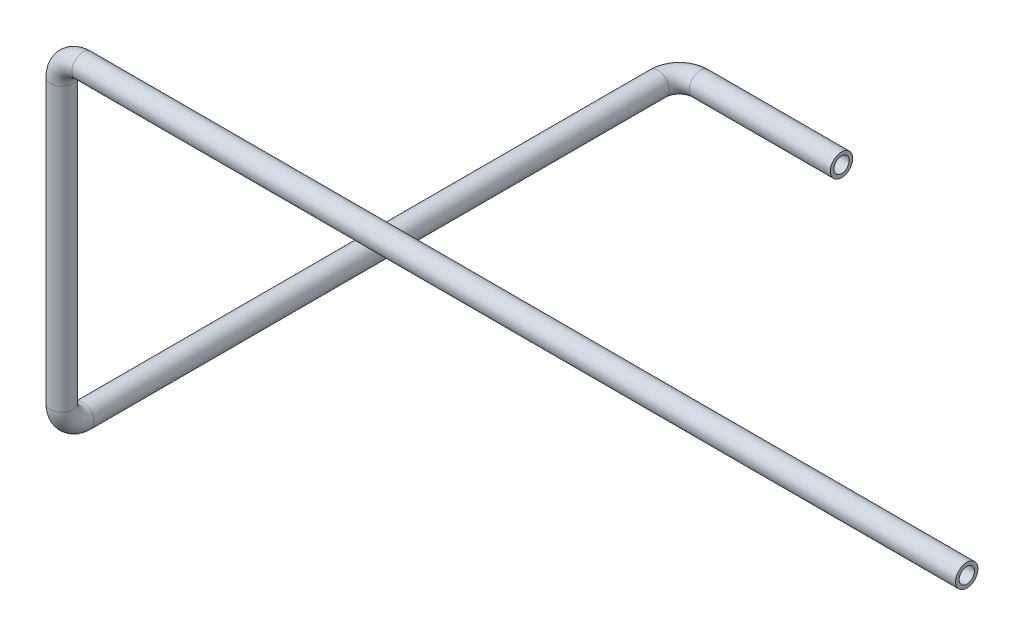
ISO-10303-21;
HEADER;
FILE_DESCRIPTION(('STEP AP214'),'2;1');
FILE_NAME('part.step','',(''),(''),'','','');
FILE_SCHEMA(('AUTOMOTIVE_DESIGN { 1 0 10303 214 1 1 1 1 }'));
ENDSEC;
DATA;
#1=APPLICATION_CONTEXT('core data for automotive mechanical design processes');
#2=APPLICATION_PROTOCOL_DEFINITION('international standard','automotive_design',2000,#1);
#3=PRODUCT_CONTEXT('',#1,'mechanical');
#4=PRODUCT('Part','Part','',(#3));
#5=PRODUCT_RELATED_PRODUCT_CATEGORY('part','',(#4));
#6=PRODUCT_DEFINITION_FORMATION('','',#4);
#7=PRODUCT_DEFINITION_CONTEXT('part definition',#1,'design');
#8=PRODUCT_DEFINITION('design','',#6,#7);
#9=PRODUCT_DEFINITION_SHAPE('','',#8);
#10=(LENGTH_UNIT() NAMED_UNIT(*) SI_UNIT(.MILLI.,.METRE.));
#11=(NAMED_UNIT(*) PLANE_ANGLE_UNIT() SI_UNIT($,.RADIAN.));
#12=(NAMED_UNIT(*) SI_UNIT($,.STERADIAN.) SOLID_ANGLE_UNIT());
#13=UNCERTAINTY_MEASURE_WITH_UNIT(LENGTH_MEASURE(1.E-05),#10,'distance_accuracy_value','');
#14=(GEOMETRIC_REPRESENTATION_CONTEXT(3) GLOBAL_UNCERTAINTY_ASSIGNED_CONTEXT((#13)) GLOBAL_UNIT_ASSIGNED_CONTEXT((#10,
#11,#12)) REPRESENTATION_CONTEXT('',''));
#15=CARTESIAN_POINT('',(0.,0.,0.));
#16=DIRECTION('',(0.,0.,1.));
#17=DIRECTION('',(1.,0.,0.));
#18=AXIS2_PLACEMENT_3D('',#15,#16,#17);
#19=CARTESIAN_POINT('',(76.5,326.,225.));
#20=DIRECTION('',(1.,0.,0.));
#21=DIRECTION('',(0.,-1.,0.));
#22=AXIS2_PLACEMENT_3D('',#19,#20,#21);
#23=PLANE('',#22);
#24=CARTESIAN_POINT('',(76.5,326.,225.));
#25=DIRECTION('',(1.,0.,0.));
#26=DIRECTION('',(0.,-1.,0.));
#27=AXIS2_PLACEMENT_3D('',#24,#25,#26);
#28=CIRCLE('',#27,2.175);
#29=CARTESIAN_POINT('',(76.5,323.825,225.));
#30=VERTEX_POINT('',#29);
#31=EDGE_CURVE('E263',#30,#30,#28,.T.);
#32=ORIENTED_EDGE('',*,*,#31,.F.);
#33=EDGE_LOOP('',(#32));
#34=FACE_BOUND('',#33,.T.);
#35=CARTESIAN_POINT('',(76.5,326.,225.));
#36=DIRECTION('',(1.,0.,0.));
#37=DIRECTION('',(0.,0.,-1.));
#38=AXIS2_PLACEMENT_3D('',#35,#36,#37);
#39=CIRCLE('',#38,3.175);
#40=CARTESIAN_POINT('',(76.5,326.,221.825));
#41=VERTEX_POINT('',#40);
#42=EDGE_CURVE('E75',#41,#41,#39,.T.);
#43=ORIENTED_EDGE('',*,*,#42,.T.);
#44=EDGE_LOOP('',(#43));
#45=FACE_BOUND('',#44,.T.);
#46=ADVANCED_FACE('F52',(#34,#45),#23,.T.);
#47=CARTESIAN_POINT('',(-134.,234.,50.));
#48=DIRECTION('',(-1.,0.,0.));
#49=DIRECTION('',(0.,0.,1.));
#50=AXIS2_PLACEMENT_3D('',#47,#48,#49);
#51=PLANE('',#50);
#52=CARTESIAN_POINT('',(-134.,234.,50.));
#53=DIRECTION('',(-1.,0.,0.));
#54=DIRECTION('',(0.,0.,1.));
#55=AXIS2_PLACEMENT_3D('',#52,#53,#54);
#56=CIRCLE('',#55,2.175);
#57=CARTESIAN_POINT('',(-134.,234.,52.175));
#58=VERTEX_POINT('',#57);
#59=EDGE_CURVE('E73',#58,#58,#56,.T.);
#60=ORIENTED_EDGE('',*,*,#59,.T.);
#61=EDGE_LOOP('',(#60));
#62=FACE_BOUND('',#61,.T.);
#63=CARTESIAN_POINT('',(-134.,234.,50.));
#64=DIRECTION('',(-1.,0.,0.));
#65=DIRECTION('',(0.,0.,1.));
#66=AXIS2_PLACEMENT_3D('',#63,#64,#65);
#67=CIRCLE('',#66,3.175);
#68=CARTESIAN_POINT('',(-134.,234.,53.175));
#69=VERTEX_POINT('',#68);
#70=EDGE_CURVE('E11',#69,#69,#67,.T.);
#71=ORIENTED_EDGE('',*,*,#70,.F.);
#72=EDGE_LOOP('',(#71));
#73=FACE_BOUND('',#72,.T.);
#74=ADVANCED_FACE('F149',(#62,#73),#51,.F.);
#75=CARTESIAN_POINT('',(76.5,326.,225.));
#76=DIRECTION('',(-1.,0.,0.));
#77=DIRECTION('',(0.,0.,1.));
#78=AXIS2_PLACEMENT_3D('',#75,#76,#77);
#79=CYLINDRICAL_SURFACE('',#78,3.175);
#80=CARTESIAN_POINT('',(-174.,326.,225.));
#81=DIRECTION('',(-1.,0.,0.));
#82=DIRECTION('',(0.,0.,1.));
#83=AXIS2_PLACEMENT_3D('',#80,#81,#82);
#84=CIRCLE('',#83,3.175);
#85=CARTESIAN_POINT('',(-174.,329.175,225.));
#86=VERTEX_POINT('',#85);
#87=EDGE_CURVE('E74',#86,#86,#84,.F.);
#88=ORIENTED_EDGE('',*,*,#87,.T.);
#89=EDGE_LOOP('',(#88));
#90=FACE_BOUND('',#89,.T.);
#91=ORIENTED_EDGE('',*,*,#42,.F.);
#92=EDGE_LOOP('',(#91));
#93=FACE_BOUND('',#92,.T.);
#94=ADVANCED_FACE('F155',(#90,#93),#79,.T.);
#95=CARTESIAN_POINT('',(-174.,320.,225.));
#96=DIRECTION('',(0.,0.,1.));
#97=DIRECTION('',(1.,0.,0.));
#98=AXIS2_PLACEMENT_3D('',#95,#96,#97);
#99=TOROIDAL_SURFACE('',#98,6.00000000000001,3.175);
#100=CARTESIAN_POINT('',(-180.,320.,225.));
#101=DIRECTION('',(0.,1.,0.));
#102=DIRECTION('',(-1.,0.,0.));
#103=AXIS2_PLACEMENT_3D('',#100,#101,#102);
#104=CIRCLE('',#103,3.175);
#105=CARTESIAN_POINT('',(-183.175,320.,225.));
#106=VERTEX_POINT('',#105);
#107=EDGE_CURVE('E78',#106,#106,#104,.T.);
#108=CARTESIAN_POINT('',(-174.,320.,225.));
#109=DIRECTION('',(0.,0.,1.));
#110=DIRECTION('',(1.,0.,0.));
#111=AXIS2_PLACEMENT_3D('',#108,#109,#110);
#112=CIRCLE('',#111,9.175);
#113=EDGE_CURVE('',#86,#106,#112,.T.);
#114=ORIENTED_EDGE('',*,*,#87,.F.);
#115=ORIENTED_EDGE('',*,*,#107,.T.);
#116=ORIENTED_EDGE('',*,*,#113,.T.);
#117=ORIENTED_EDGE('',*,*,#113,.F.);
#118=EDGE_LOOP('',(#114,#116,#115,#117));
#119=FACE_BOUND('',#118,.T.);
#120=ADVANCED_FACE('F158',(#119),#99,.T.);
#121=CARTESIAN_POINT('',(-180.,320.,225.));
#122=DIRECTION('',(0.,-1.,0.));
#123=DIRECTION('',(0.,0.,-1.));
#124=AXIS2_PLACEMENT_3D('',#121,#122,#123);
#125=CYLINDRICAL_SURFACE('',#124,3.175);
#126=CARTESIAN_POINT('',(-180.,240.,225.));
#127=DIRECTION('',(0.,-1.,0.));
#128=DIRECTION('',(0.,0.,-1.));
#129=AXIS2_PLACEMENT_3D('',#126,#127,#128);
#130=CIRCLE('',#129,3.175);
#131=CARTESIAN_POINT('',(-180.,240.,228.175));
#132=VERTEX_POINT('',#131);
#133=EDGE_CURVE('E91',#132,#132,#130,.F.);
#134=ORIENTED_EDGE('',*,*,#133,.T.);
#135=EDGE_LOOP('',(#134));
#136=FACE_BOUND('',#135,.T.);
#137=ORIENTED_EDGE('',*,*,#107,.F.);
#138=EDGE_LOOP('',(#137));
#139=FACE_BOUND('',#138,.T.);
#140=ADVANCED_FACE('F109',(#136,#139),#125,.T.);
#141=CARTESIAN_POINT('',(-180.,240.,219.));
#142=DIRECTION('',(1.,0.,0.));
#143=DIRECTION('',(0.,0.,-1.));
#144=AXIS2_PLACEMENT_3D('',#141,#142,#143);
#145=TOROIDAL_SURFACE('',#144,6.00000000000001,3.175);
#146=CARTESIAN_POINT('',(-180.,234.,219.));
#147=DIRECTION('',(0.,0.,1.));
#148=DIRECTION('',(0.,-1.,0.));
#149=AXIS2_PLACEMENT_3D('',#146,#147,#148);
#150=CIRCLE('',#149,3.175);
#151=CARTESIAN_POINT('',(-180.,230.825,219.));
#152=VERTEX_POINT('',#151);
#153=EDGE_CURVE('E68',#152,#152,#150,.T.);
#154=CARTESIAN_POINT('',(-180.,240.,219.));
#155=DIRECTION('',(1.,0.,0.));
#156=DIRECTION('',(0.,0.,-1.));
#157=AXIS2_PLACEMENT_3D('',#154,#155,#156);
#158=CIRCLE('',#157,9.175);
#159=EDGE_CURVE('',#132,#152,#158,.T.);
#160=ORIENTED_EDGE('',*,*,#133,.F.);
#161=ORIENTED_EDGE('',*,*,#153,.T.);
#162=ORIENTED_EDGE('',*,*,#159,.T.);
#163=ORIENTED_EDGE('',*,*,#159,.F.);
#164=EDGE_LOOP('',(#160,#162,#161,#163));
#165=FACE_BOUND('',#164,.T.);
#166=ADVANCED_FACE('F98',(#165),#145,.T.);
#167=CARTESIAN_POINT('',(-180.,234.,219.));
#168=DIRECTION('',(0.,0.,-1.));
#169=DIRECTION('',(-1.,0.,0.));
#170=AXIS2_PLACEMENT_3D('',#167,#168,#169);
#171=CYLINDRICAL_SURFACE('',#170,3.175);
#172=CARTESIAN_POINT('',(-180.,234.,56.));
#173=DIRECTION('',(0.,0.,-1.));
#174=DIRECTION('',(-1.,0.,0.));
#175=AXIS2_PLACEMENT_3D('',#172,#173,#174);
#176=CIRCLE('',#175,3.175);
#177=CARTESIAN_POINT('',(-183.175,234.,56.));
#178=VERTEX_POINT('',#177);
#179=EDGE_CURVE('E63',#178,#178,#176,.F.);
#180=ORIENTED_EDGE('',*,*,#179,.T.);
#181=EDGE_LOOP('',(#180));
#182=FACE_BOUND('',#181,.T.);
#183=ORIENTED_EDGE('',*,*,#153,.F.);
#184=EDGE_LOOP('',(#183));
#185=FACE_BOUND('',#184,.T.);
#186=ADVANCED_FACE('F101',(#182,#185),#171,.T.);
#187=CARTESIAN_POINT('',(-174.,234.,56.));
#188=DIRECTION('',(0.,-1.,0.));
#189=DIRECTION('',(0.,0.,-1.));
#190=AXIS2_PLACEMENT_3D('',#187,#188,#189);
#191=TOROIDAL_SURFACE('',#190,6.00000000000001,3.175);
#192=CARTESIAN_POINT('',(-174.,234.,50.));
#193=DIRECTION('',(-1.,0.,0.));
#194=DIRECTION('',(0.,0.,1.));
#195=AXIS2_PLACEMENT_3D('',#192,#193,#194);
#196=CIRCLE('',#195,3.175);
#197=CARTESIAN_POINT('',(-174.,234.,46.825));
#198=VERTEX_POINT('',#197);
#199=EDGE_CURVE('E58',#198,#198,#196,.T.);
#200=CARTESIAN_POINT('',(-174.,234.,56.));
#201=DIRECTION('',(0.,-1.,0.));
#202=DIRECTION('',(0.,0.,-1.));
#203=AXIS2_PLACEMENT_3D('',#200,#201,#202);
#204=CIRCLE('',#203,9.175);
#205=EDGE_CURVE('',#178,#198,#204,.T.);
#206=ORIENTED_EDGE('',*,*,#179,.F.);
#207=ORIENTED_EDGE('',*,*,#199,.T.);
#208=ORIENTED_EDGE('',*,*,#205,.T.);
#209=ORIENTED_EDGE('',*,*,#205,.F.);
#210=EDGE_LOOP('',(#206,#208,#207,#209));
#211=FACE_BOUND('',#210,.T.);
#212=ADVANCED_FACE('F103',(#211),#191,.T.);
#213=CARTESIAN_POINT('',(-174.,234.,50.));
#214=DIRECTION('',(1.,0.,0.));
#215=DIRECTION('',(0.,0.,-1.));
#216=AXIS2_PLACEMENT_3D('',#213,#214,#215);
#217=CYLINDRICAL_SURFACE('',#216,3.175);
#218=ORIENTED_EDGE('',*,*,#70,.T.);
#219=EDGE_LOOP('',(#218));
#220=FACE_BOUND('',#219,.T.);
#221=ORIENTED_EDGE('',*,*,#199,.F.);
#222=EDGE_LOOP('',(#221));
#223=FACE_BOUND('',#222,.T.);
#224=ADVANCED_FACE('F54',(#220,#223),#217,.T.);
#225=CARTESIAN_POINT('',(76.5,326.,225.));
#226=DIRECTION('',(-1.,0.,0.));
#227=DIRECTION('',(0.,0.,1.));
#228=AXIS2_PLACEMENT_3D('',#225,#226,#227);
#229=CYLINDRICAL_SURFACE('',#228,2.175);
#230=CARTESIAN_POINT('',(-174.,326.,225.));
#231=DIRECTION('',(1.,0.,0.));
#232=DIRECTION('',(0.,-1.,0.));
#233=AXIS2_PLACEMENT_3D('',#230,#231,#232);
#234=CIRCLE('',#233,2.175);
#235=CARTESIAN_POINT('',(-174.,328.175,225.));
#236=VERTEX_POINT('',#235);
#237=EDGE_CURVE('E262',#236,#236,#234,.T.);
#238=ORIENTED_EDGE('',*,*,#237,.F.);
#239=EDGE_LOOP('',(#238));
#240=FACE_BOUND('',#239,.T.);
#241=ORIENTED_EDGE('',*,*,#31,.T.);
#242=EDGE_LOOP('',(#241));
#243=FACE_BOUND('',#242,.T.);
#244=ADVANCED_FACE('F114',(#240,#243),#229,.F.);
#245=CARTESIAN_POINT('',(-174.,320.,225.));
#246=DIRECTION('',(0.,0.,1.));
#247=DIRECTION('',(1.,0.,0.));
#248=AXIS2_PLACEMENT_3D('',#245,#246,#247);
#249=TOROIDAL_SURFACE('',#248,6.00000000000001,2.175);
#250=CARTESIAN_POINT('',(-180.,320.,225.));
#251=DIRECTION('',(0.,1.,0.));
#252=DIRECTION('',(1.,0.,0.));
#253=AXIS2_PLACEMENT_3D('',#250,#251,#252);
#254=CIRCLE('',#253,2.175);
#255=CARTESIAN_POINT('',(-182.175,320.,225.));
#256=VERTEX_POINT('',#255);
#257=EDGE_CURVE('E270',#256,#256,#254,.T.);
#258=CARTESIAN_POINT('',(-174.,320.,225.));
#259=DIRECTION('',(0.,0.,1.));
#260=DIRECTION('',(1.,0.,0.));
#261=AXIS2_PLACEMENT_3D('',#258,#259,#260);
#262=CIRCLE('',#261,8.175);
#263=EDGE_CURVE('',#236,#256,#262,.T.);
#264=ORIENTED_EDGE('',*,*,#237,.T.);
#265=ORIENTED_EDGE('',*,*,#257,.F.);
#266=ORIENTED_EDGE('',*,*,#263,.T.);
#267=ORIENTED_EDGE('',*,*,#263,.F.);
#268=EDGE_LOOP('',(#264,#266,#265,#267));
#269=FACE_BOUND('',#268,.T.);
#270=ADVANCED_FACE('F116',(#269),#249,.F.);
#271=CARTESIAN_POINT('',(-180.,320.,225.));
#272=DIRECTION('',(0.,-1.,0.));
#273=DIRECTION('',(0.,0.,-1.));
#274=AXIS2_PLACEMENT_3D('',#271,#272,#273);
#275=CYLINDRICAL_SURFACE('',#274,2.175);
#276=CARTESIAN_POINT('',(-180.,240.,225.));
#277=DIRECTION('',(0.,1.,0.));
#278=DIRECTION('',(1.,0.,0.));
#279=AXIS2_PLACEMENT_3D('',#276,#277,#278);
#280=CIRCLE('',#279,2.175);
#281=CARTESIAN_POINT('',(-180.,240.,227.175));
#282=VERTEX_POINT('',#281);
#283=EDGE_CURVE('E275',#282,#282,#280,.T.);
#284=ORIENTED_EDGE('',*,*,#283,.F.);
#285=EDGE_LOOP('',(#284));
#286=FACE_BOUND('',#285,.T.);
#287=ORIENTED_EDGE('',*,*,#257,.T.);
#288=EDGE_LOOP('',(#287));
#289=FACE_BOUND('',#288,.T.);
#290=ADVANCED_FACE('F123',(#286,#289),#275,.F.);
#291=CARTESIAN_POINT('',(-180.,240.,219.));
#292=DIRECTION('',(1.,0.,0.));
#293=DIRECTION('',(0.,0.,-1.));
#294=AXIS2_PLACEMENT_3D('',#291,#292,#293);
#295=TOROIDAL_SURFACE('',#294,6.00000000000001,2.175);
#296=CARTESIAN_POINT('',(-180.,234.,219.));
#297=DIRECTION('',(0.,0.,1.));
#298=DIRECTION('',(1.,0.,0.));
#299=AXIS2_PLACEMENT_3D('',#296,#297,#298);
#300=CIRCLE('',#299,2.175);
#301=CARTESIAN_POINT('',(-180.,231.825,219.));
#302=VERTEX_POINT('',#301);
#303=EDGE_CURVE('E274',#302,#302,#300,.T.);
#304=CARTESIAN_POINT('',(-180.,240.,219.));
#305=DIRECTION('',(1.,0.,0.));
#306=DIRECTION('',(0.,0.,-1.));
#307=AXIS2_PLACEMENT_3D('',#304,#305,#306);
#308=CIRCLE('',#307,8.175);
#309=EDGE_CURVE('',#282,#302,#308,.T.);
#310=ORIENTED_EDGE('',*,*,#283,.T.);
#311=ORIENTED_EDGE('',*,*,#303,.F.);
#312=ORIENTED_EDGE('',*,*,#309,.T.);
#313=ORIENTED_EDGE('',*,*,#309,.F.);
#314=EDGE_LOOP('',(#310,#312,#311,#313));
#315=FACE_BOUND('',#314,.T.);
#316=ADVANCED_FACE('F131',(#315),#295,.F.);
#317=CARTESIAN_POINT('',(-180.,234.,219.));
#318=DIRECTION('',(0.,0.,-1.));
#319=DIRECTION('',(-1.,0.,0.));
#320=AXIS2_PLACEMENT_3D('',#317,#318,#319);
#321=CYLINDRICAL_SURFACE('',#320,2.175);
#322=CARTESIAN_POINT('',(-180.,234.,56.));
#323=DIRECTION('',(0.,0.,1.));
#324=DIRECTION('',(1.,0.,0.));
#325=AXIS2_PLACEMENT_3D('',#322,#323,#324);
#326=CIRCLE('',#325,2.175);
#327=CARTESIAN_POINT('',(-182.175,234.,56.));
#328=VERTEX_POINT('',#327);
#329=EDGE_CURVE('E87',#328,#328,#326,.T.);
#330=ORIENTED_EDGE('',*,*,#329,.F.);
#331=EDGE_LOOP('',(#330));
#332=FACE_BOUND('',#331,.T.);
#333=ORIENTED_EDGE('',*,*,#303,.T.);
#334=EDGE_LOOP('',(#333));
#335=FACE_BOUND('',#334,.T.);
#336=ADVANCED_FACE('F136',(#332,#335),#321,.F.);
#337=CARTESIAN_POINT('',(-174.,234.,56.));
#338=DIRECTION('',(0.,-1.,0.));
#339=DIRECTION('',(0.,0.,-1.));
#340=AXIS2_PLACEMENT_3D('',#337,#338,#339);
#341=TOROIDAL_SURFACE('',#340,6.00000000000001,2.175);
#342=CARTESIAN_POINT('',(-174.,234.,50.));
#343=DIRECTION('',(-1.,0.,0.));
#344=DIRECTION('',(0.,0.,1.));
#345=AXIS2_PLACEMENT_3D('',#342,#343,#344);
#346=CIRCLE('',#345,2.175);
#347=CARTESIAN_POINT('',(-174.,234.,47.825));
#348=VERTEX_POINT('',#347);
#349=EDGE_CURVE('E85',#348,#348,#346,.T.);
#350=CARTESIAN_POINT('',(-174.,234.,56.));
#351=DIRECTION('',(0.,-1.,0.));
#352=DIRECTION('',(0.,0.,-1.));
#353=AXIS2_PLACEMENT_3D('',#350,#351,#352);
#354=CIRCLE('',#353,8.175);
#355=EDGE_CURVE('',#328,#348,#354,.T.);
#356=ORIENTED_EDGE('',*,*,#329,.T.);
#357=ORIENTED_EDGE('',*,*,#349,.F.);
#358=ORIENTED_EDGE('',*,*,#355,.T.);
#359=ORIENTED_EDGE('',*,*,#355,.F.);
#360=EDGE_LOOP('',(#356,#358,#357,#359));
#361=FACE_BOUND('',#360,.T.);
#362=ADVANCED_FACE('F139',(#361),#341,.F.);
#363=CARTESIAN_POINT('',(-174.,234.,50.));
#364=DIRECTION('',(1.,0.,0.));
#365=DIRECTION('',(0.,0.,-1.));
#366=AXIS2_PLACEMENT_3D('',#363,#364,#365);
#367=CYLINDRICAL_SURFACE('',#366,2.175);
#368=ORIENTED_EDGE('',*,*,#59,.F.);
#369=EDGE_LOOP('',(#368));
#370=FACE_BOUND('',#369,.T.);
#371=ORIENTED_EDGE('',*,*,#349,.T.);
#372=EDGE_LOOP('',(#371));
#373=FACE_BOUND('',#372,.T.);
#374=ADVANCED_FACE('F145',(#370,#373),#367,.F.);
#375=CLOSED_SHELL('',(#46,#74,#94,#120,#140,#166,#186,#212,#224,#244,#270,#290,#316,#336,#362,#374));
#376=MANIFOLD_SOLID_BREP('B2',#375);
#377=ADVANCED_BREP_SHAPE_REPRESENTATION('',(#18,#376),#14);
#378=SHAPE_DEFINITION_REPRESENTATION(#9,#377);
ENDSEC;
END-ISO-10303-21;
